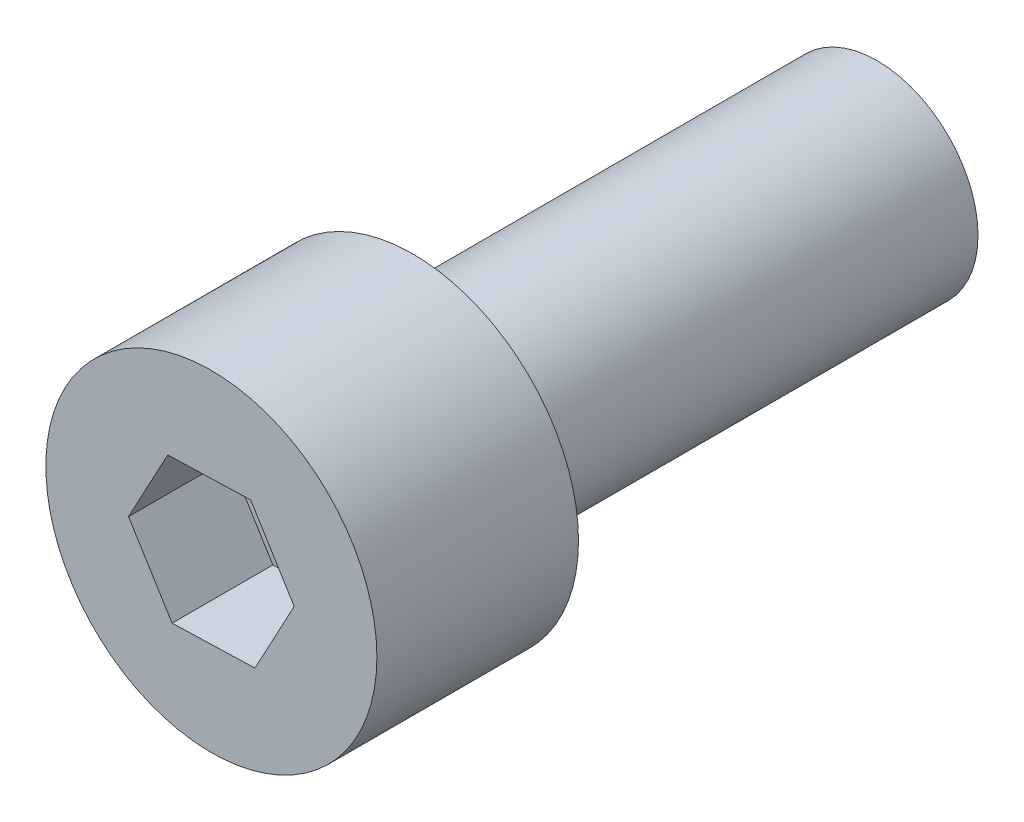
ISO-10303-21;
HEADER;
FILE_DESCRIPTION(('STEP AP214'),'2;1');
FILE_NAME('part.step','',(''),(''),'','','');
FILE_SCHEMA(('AUTOMOTIVE_DESIGN { 1 0 10303 214 1 1 1 1 }'));
ENDSEC;
DATA;
#1=APPLICATION_CONTEXT('core data for automotive mechanical design processes');
#2=APPLICATION_PROTOCOL_DEFINITION('international standard','automotive_design',2000,#1);
#3=PRODUCT_CONTEXT('',#1,'mechanical');
#4=PRODUCT('Part','Part','',(#3));
#5=PRODUCT_RELATED_PRODUCT_CATEGORY('part','',(#4));
#6=PRODUCT_DEFINITION_FORMATION('','',#4);
#7=PRODUCT_DEFINITION_CONTEXT('part definition',#1,'design');
#8=PRODUCT_DEFINITION('design','',#6,#7);
#9=PRODUCT_DEFINITION_SHAPE('','',#8);
#10=(LENGTH_UNIT() NAMED_UNIT(*) SI_UNIT(.MILLI.,.METRE.));
#11=(NAMED_UNIT(*) PLANE_ANGLE_UNIT() SI_UNIT($,.RADIAN.));
#12=(NAMED_UNIT(*) SI_UNIT($,.STERADIAN.) SOLID_ANGLE_UNIT());
#13=UNCERTAINTY_MEASURE_WITH_UNIT(LENGTH_MEASURE(1.E-05),#10,'distance_accuracy_value','');
#14=(GEOMETRIC_REPRESENTATION_CONTEXT(3) GLOBAL_UNCERTAINTY_ASSIGNED_CONTEXT((#13)) GLOBAL_UNIT_ASSIGNED_CONTEXT((#10,
#11,#12)) REPRESENTATION_CONTEXT('',''));
#15=CARTESIAN_POINT('',(0.,0.,0.));
#16=DIRECTION('',(0.,0.,1.));
#17=DIRECTION('',(1.,0.,0.));
#18=AXIS2_PLACEMENT_3D('',#15,#16,#17);
#19=CARTESIAN_POINT('',(0.,0.,11.1125));
#20=DIRECTION('',(0.,0.,-1.));
#21=DIRECTION('',(-1.,0.,0.));
#22=AXIS2_PLACEMENT_3D('',#19,#20,#21);
#23=CYLINDRICAL_SURFACE('',#22,2.413);
#24=CARTESIAN_POINT('',(0.,0.,11.1125));
#25=DIRECTION('',(0.,0.,1.));
#26=DIRECTION('',(1.,0.,0.));
#27=AXIS2_PLACEMENT_3D('',#24,#25,#26);
#28=CIRCLE('',#27,2.413);
#29=CARTESIAN_POINT('',(2.413,0.,11.1125));
#30=VERTEX_POINT('',#29);
#31=EDGE_CURVE('E11',#30,#30,#28,.T.);
#32=ORIENTED_EDGE('',*,*,#31,.F.);
#33=EDGE_LOOP('',(#32));
#34=FACE_BOUND('',#33,.T.);
#35=CARTESIAN_POINT('',(0.,0.,0.));
#36=DIRECTION('',(0.,0.,1.));
#37=DIRECTION('',(1.,0.,0.));
#38=AXIS2_PLACEMENT_3D('',#35,#36,#37);
#39=CIRCLE('',#38,2.413);
#40=CARTESIAN_POINT('',(2.413,0.,0.));
#41=VERTEX_POINT('',#40);
#42=EDGE_CURVE('E38',#41,#41,#39,.T.);
#43=ORIENTED_EDGE('',*,*,#42,.T.);
#44=EDGE_LOOP('',(#43));
#45=FACE_BOUND('',#44,.T.);
#46=ADVANCED_FACE('F35',(#34,#45),#23,.T.);
#47=CARTESIAN_POINT('',(0.,0.,0.));
#48=DIRECTION('',(0.,0.,1.));
#49=DIRECTION('',(1.,0.,0.));
#50=AXIS2_PLACEMENT_3D('',#47,#48,#49);
#51=PLANE('',#50);
#52=ORIENTED_EDGE('',*,*,#42,.F.);
#53=EDGE_LOOP('',(#52));
#54=FACE_BOUND('',#53,.T.);
#55=ADVANCED_FACE('F166',(#54),#51,.F.);
#56=CARTESIAN_POINT('',(0.,0.,15.9385));
#57=DIRECTION('',(0.,0.,-1.));
#58=DIRECTION('',(-1.,0.,0.));
#59=AXIS2_PLACEMENT_3D('',#56,#57,#58);
#60=CYLINDRICAL_SURFACE('',#59,3.9624);
#61=CARTESIAN_POINT('',(0.,0.,15.9385));
#62=DIRECTION('',(0.,0.,1.));
#63=DIRECTION('',(1.,0.,0.));
#64=AXIS2_PLACEMENT_3D('',#61,#62,#63);
#65=CIRCLE('',#64,3.9624);
#66=CARTESIAN_POINT('',(3.9624,0.,15.9385));
#67=VERTEX_POINT('',#66);
#68=EDGE_CURVE('E142',#67,#67,#65,.T.);
#69=ORIENTED_EDGE('',*,*,#68,.F.);
#70=EDGE_LOOP('',(#69));
#71=FACE_BOUND('',#70,.T.);
#72=CARTESIAN_POINT('',(0.,0.,11.1125));
#73=DIRECTION('',(0.,0.,1.));
#74=DIRECTION('',(1.,0.,0.));
#75=AXIS2_PLACEMENT_3D('',#72,#73,#74);
#76=CIRCLE('',#75,3.9624);
#77=CARTESIAN_POINT('',(3.9624,0.,11.1125));
#78=VERTEX_POINT('',#77);
#79=EDGE_CURVE('E136',#78,#78,#76,.T.);
#80=ORIENTED_EDGE('',*,*,#79,.T.);
#81=EDGE_LOOP('',(#80));
#82=FACE_BOUND('',#81,.T.);
#83=ADVANCED_FACE('F148',(#71,#82),#60,.T.);
#84=CARTESIAN_POINT('',(0.,0.,15.9385));
#85=DIRECTION('',(0.,0.,1.));
#86=DIRECTION('',(1.,0.,0.));
#87=AXIS2_PLACEMENT_3D('',#84,#85,#86);
#88=PLANE('',#87);
#89=DIRECTION('',(-0.999547217448398,-0.030089202235447,0.));
#90=VECTOR('',#89,1.);
#91=CARTESIAN_POINT('',(-0.0517088705698295,1.71774104514422,15.9385));
#92=LINE('',#91,#90);
#93=CARTESIAN_POINT('',(0.940029384242255,1.7475951754872,15.9385));
#94=VERTEX_POINT('',#93);
#95=CARTESIAN_POINT('',(-1.04344712538191,1.68788691480123,15.9385));
#96=VERTEX_POINT('',#95);
#97=EDGE_CURVE('E49',#94,#96,#92,.T.);
#98=ORIENTED_EDGE('',*,*,#97,.F.);
#99=DIRECTION('',(-0.525831622239703,0.850588681474638,0.));
#100=VECTOR('',#99,1.);
#101=CARTESIAN_POINT('',(1.46175294693321,0.903651718086582,15.9385));
#102=LINE('',#101,#100);
#103=CARTESIAN_POINT('',(1.98347650962416,0.0597082606859642,15.9385));
#104=VERTEX_POINT('',#103);
#105=EDGE_CURVE('E132',#104,#94,#102,.T.);
#106=ORIENTED_EDGE('',*,*,#105,.F.);
#107=DIRECTION('',(0.473715595208694,0.880677883710084,0.));
#108=VECTOR('',#107,1.);
#109=CARTESIAN_POINT('',(1.51346181750304,-0.814089327057635,15.9385));
#110=LINE('',#109,#108);
#111=CARTESIAN_POINT('',(1.04344712538191,-1.68788691480123,15.9385));
#112=VERTEX_POINT('',#111);
#113=EDGE_CURVE('E130',#112,#104,#110,.T.);
#114=ORIENTED_EDGE('',*,*,#113,.F.);
#115=DIRECTION('',(0.999547217448398,0.0300892022354463,0.));
#116=VECTOR('',#115,1.);
#117=CARTESIAN_POINT('',(0.0517088705698284,-1.71774104514422,15.9385));
#118=LINE('',#117,#116);
#119=CARTESIAN_POINT('',(-0.940029384242252,-1.7475951754872,15.9385));
#120=VERTEX_POINT('',#119);
#121=EDGE_CURVE('E97',#120,#112,#118,.T.);
#122=ORIENTED_EDGE('',*,*,#121,.F.);
#123=DIRECTION('',(0.525831622239703,-0.850588681474638,0.));
#124=VECTOR('',#123,1.);
#125=CARTESIAN_POINT('',(-1.46175294693321,-0.90365171808658,15.9385));
#126=LINE('',#125,#124);
#127=CARTESIAN_POINT('',(-1.98347650962416,-0.0597082606859649,15.9385));
#128=VERTEX_POINT('',#127);
#129=EDGE_CURVE('E126',#128,#120,#126,.T.);
#130=ORIENTED_EDGE('',*,*,#129,.F.);
#131=DIRECTION('',(-0.473715595208694,-0.880677883710084,0.));
#132=VECTOR('',#131,1.);
#133=CARTESIAN_POINT('',(-1.51346181750304,0.814089327057633,15.9385));
#134=LINE('',#133,#132);
#135=EDGE_CURVE('E123',#96,#128,#134,.T.);
#136=ORIENTED_EDGE('',*,*,#135,.F.);
#137=EDGE_LOOP('',(#98,#106,#114,#122,#130,#136));
#138=FACE_BOUND('',#137,.T.);
#139=ORIENTED_EDGE('',*,*,#68,.T.);
#140=EDGE_LOOP('',(#139));
#141=FACE_BOUND('',#140,.T.);
#142=ADVANCED_FACE('F153',(#138,#141),#88,.T.);
#143=CARTESIAN_POINT('',(0.,0.,11.1125));
#144=DIRECTION('',(0.,0.,1.));
#145=DIRECTION('',(1.,0.,0.));
#146=AXIS2_PLACEMENT_3D('',#143,#144,#145);
#147=PLANE('',#146);
#148=ORIENTED_EDGE('',*,*,#31,.T.);
#149=EDGE_LOOP('',(#148));
#150=FACE_BOUND('',#149,.T.);
#151=ORIENTED_EDGE('',*,*,#79,.F.);
#152=EDGE_LOOP('',(#151));
#153=FACE_BOUND('',#152,.T.);
#154=ADVANCED_FACE('F150',(#150,#153),#147,.F.);
#155=CARTESIAN_POINT('',(-0.0517088705698295,1.71774104514422,13.5255));
#156=DIRECTION('',(-0.030089202235447,0.999547217448398,0.));
#157=DIRECTION('',(-0.999547217448398,-0.030089202235447,0.));
#158=AXIS2_PLACEMENT_3D('',#155,#156,#157);
#159=PLANE('',#158);
#160=ORIENTED_EDGE('',*,*,#97,.T.);
#161=DIRECTION('',(0.,0.,1.));
#162=VECTOR('',#161,1.);
#163=CARTESIAN_POINT('',(-1.04344712538191,1.68788691480123,13.5255));
#164=LINE('',#163,#162);
#165=CARTESIAN_POINT('',(-1.04344712538191,1.68788691480123,13.5255));
#166=VERTEX_POINT('',#165);
#167=EDGE_CURVE('E79',#166,#96,#164,.T.);
#168=ORIENTED_EDGE('',*,*,#167,.F.);
#169=DIRECTION('',(-0.999547217448398,-0.030089202235447,0.));
#170=VECTOR('',#169,1.);
#171=CARTESIAN_POINT('',(-0.0517088705698295,1.71774104514422,13.5255));
#172=LINE('',#171,#170);
#173=CARTESIAN_POINT('',(0.940029384242255,1.7475951754872,13.5255));
#174=VERTEX_POINT('',#173);
#175=EDGE_CURVE('E134',#174,#166,#172,.T.);
#176=ORIENTED_EDGE('',*,*,#175,.F.);
#177=DIRECTION('',(0.,0.,1.));
#178=VECTOR('',#177,1.);
#179=CARTESIAN_POINT('',(0.940029384242255,1.7475951754872,13.5255));
#180=LINE('',#179,#178);
#181=EDGE_CURVE('E57',#174,#94,#180,.T.);
#182=ORIENTED_EDGE('',*,*,#181,.T.);
#183=EDGE_LOOP('',(#160,#168,#176,#182));
#184=FACE_BOUND('',#183,.T.);
#185=ADVANCED_FACE('F152',(#184),#159,.F.);
#186=CARTESIAN_POINT('',(1.46175294693321,0.903651718086582,13.5255));
#187=DIRECTION('',(0.850588681474637,0.525831622239703,0.));
#188=DIRECTION('',(-0.525831622239703,0.850588681474638,0.));
#189=AXIS2_PLACEMENT_3D('',#186,#187,#188);
#190=PLANE('',#189);
#191=ORIENTED_EDGE('',*,*,#105,.T.);
#192=ORIENTED_EDGE('',*,*,#181,.F.);
#193=DIRECTION('',(-0.525831622239703,0.850588681474638,0.));
#194=VECTOR('',#193,1.);
#195=CARTESIAN_POINT('',(1.46175294693321,0.903651718086582,13.5255));
#196=LINE('',#195,#194);
#197=CARTESIAN_POINT('',(1.98347650962416,0.0597082606859642,13.5255));
#198=VERTEX_POINT('',#197);
#199=EDGE_CURVE('E109',#198,#174,#196,.T.);
#200=ORIENTED_EDGE('',*,*,#199,.F.);
#201=DIRECTION('',(0.,0.,1.));
#202=VECTOR('',#201,1.);
#203=CARTESIAN_POINT('',(1.98347650962416,0.0597082606859642,13.5255));
#204=LINE('',#203,#202);
#205=EDGE_CURVE('E101',#198,#104,#204,.T.);
#206=ORIENTED_EDGE('',*,*,#205,.T.);
#207=EDGE_LOOP('',(#191,#192,#200,#206));
#208=FACE_BOUND('',#207,.T.);
#209=ADVANCED_FACE('F160',(#208),#190,.F.);
#210=CARTESIAN_POINT('',(1.51346181750304,-0.814089327057635,13.5255));
#211=DIRECTION('',(0.880677883710084,-0.473715595208694,0.));
#212=DIRECTION('',(0.473715595208694,0.880677883710084,0.));
#213=AXIS2_PLACEMENT_3D('',#210,#211,#212);
#214=PLANE('',#213);
#215=ORIENTED_EDGE('',*,*,#113,.T.);
#216=ORIENTED_EDGE('',*,*,#205,.F.);
#217=DIRECTION('',(0.473715595208694,0.880677883710084,0.));
#218=VECTOR('',#217,1.);
#219=CARTESIAN_POINT('',(1.51346181750304,-0.814089327057635,13.5255));
#220=LINE('',#219,#218);
#221=CARTESIAN_POINT('',(1.04344712538191,-1.68788691480123,13.5255));
#222=VERTEX_POINT('',#221);
#223=EDGE_CURVE('E105',#222,#198,#220,.T.);
#224=ORIENTED_EDGE('',*,*,#223,.F.);
#225=DIRECTION('',(0.,0.,1.));
#226=VECTOR('',#225,1.);
#227=CARTESIAN_POINT('',(1.04344712538191,-1.68788691480123,13.5255));
#228=LINE('',#227,#226);
#229=EDGE_CURVE('E90',#222,#112,#228,.T.);
#230=ORIENTED_EDGE('',*,*,#229,.T.);
#231=EDGE_LOOP('',(#215,#216,#224,#230));
#232=FACE_BOUND('',#231,.T.);
#233=ADVANCED_FACE('F106',(#232),#214,.F.);
#234=CARTESIAN_POINT('',(0.0517088705698284,-1.71774104514422,13.5255));
#235=DIRECTION('',(0.0300892022354463,-0.999547217448398,0.));
#236=DIRECTION('',(0.999547217448398,0.0300892022354463,0.));
#237=AXIS2_PLACEMENT_3D('',#234,#235,#236);
#238=PLANE('',#237);
#239=ORIENTED_EDGE('',*,*,#121,.T.);
#240=ORIENTED_EDGE('',*,*,#229,.F.);
#241=DIRECTION('',(0.999547217448398,0.0300892022354463,0.));
#242=VECTOR('',#241,1.);
#243=CARTESIAN_POINT('',(0.0517088705698284,-1.71774104514422,13.5255));
#244=LINE('',#243,#242);
#245=CARTESIAN_POINT('',(-0.940029384242252,-1.7475951754872,13.5255));
#246=VERTEX_POINT('',#245);
#247=EDGE_CURVE('E94',#246,#222,#244,.T.);
#248=ORIENTED_EDGE('',*,*,#247,.F.);
#249=DIRECTION('',(0.,0.,1.));
#250=VECTOR('',#249,1.);
#251=CARTESIAN_POINT('',(-0.940029384242252,-1.7475951754872,13.5255));
#252=LINE('',#251,#250);
#253=EDGE_CURVE('E102',#246,#120,#252,.T.);
#254=ORIENTED_EDGE('',*,*,#253,.T.);
#255=EDGE_LOOP('',(#239,#240,#248,#254));
#256=FACE_BOUND('',#255,.T.);
#257=ADVANCED_FACE('F92',(#256),#238,.F.);
#258=CARTESIAN_POINT('',(-1.46175294693321,-0.90365171808658,13.5255));
#259=DIRECTION('',(-0.850588681474638,-0.525831622239703,0.));
#260=DIRECTION('',(0.525831622239703,-0.850588681474638,0.));
#261=AXIS2_PLACEMENT_3D('',#258,#259,#260);
#262=PLANE('',#261);
#263=ORIENTED_EDGE('',*,*,#129,.T.);
#264=ORIENTED_EDGE('',*,*,#253,.F.);
#265=DIRECTION('',(0.525831622239703,-0.850588681474638,0.));
#266=VECTOR('',#265,1.);
#267=CARTESIAN_POINT('',(-1.46175294693321,-0.90365171808658,13.5255));
#268=LINE('',#267,#266);
#269=CARTESIAN_POINT('',(-1.98347650962416,-0.0597082606859649,13.5255));
#270=VERTEX_POINT('',#269);
#271=EDGE_CURVE('E115',#270,#246,#268,.T.);
#272=ORIENTED_EDGE('',*,*,#271,.F.);
#273=DIRECTION('',(0.,0.,1.));
#274=VECTOR('',#273,1.);
#275=CARTESIAN_POINT('',(-1.98347650962416,-0.0597082606859649,13.5255));
#276=LINE('',#275,#274);
#277=EDGE_CURVE('E139',#270,#128,#276,.T.);
#278=ORIENTED_EDGE('',*,*,#277,.T.);
#279=EDGE_LOOP('',(#263,#264,#272,#278));
#280=FACE_BOUND('',#279,.T.);
#281=ADVANCED_FACE('F221',(#280),#262,.F.);
#282=CARTESIAN_POINT('',(-1.51346181750304,0.814089327057633,13.5255));
#283=DIRECTION('',(-0.880677883710084,0.473715595208694,0.));
#284=DIRECTION('',(-0.473715595208694,-0.880677883710084,0.));
#285=AXIS2_PLACEMENT_3D('',#282,#283,#284);
#286=PLANE('',#285);
#287=ORIENTED_EDGE('',*,*,#135,.T.);
#288=ORIENTED_EDGE('',*,*,#277,.F.);
#289=DIRECTION('',(-0.473715595208694,-0.880677883710084,0.));
#290=VECTOR('',#289,1.);
#291=CARTESIAN_POINT('',(-1.51346181750304,0.814089327057633,13.5255));
#292=LINE('',#291,#290);
#293=EDGE_CURVE('E117',#166,#270,#292,.T.);
#294=ORIENTED_EDGE('',*,*,#293,.F.);
#295=ORIENTED_EDGE('',*,*,#167,.T.);
#296=EDGE_LOOP('',(#287,#288,#294,#295));
#297=FACE_BOUND('',#296,.T.);
#298=ADVANCED_FACE('F230',(#297),#286,.F.);
#299=CARTESIAN_POINT('',(0.,0.,13.5255));
#300=DIRECTION('',(0.,0.,1.));
#301=DIRECTION('',(1.,0.,0.));
#302=AXIS2_PLACEMENT_3D('',#299,#300,#301);
#303=PLANE('',#302);
#304=ORIENTED_EDGE('',*,*,#175,.T.);
#305=ORIENTED_EDGE('',*,*,#293,.T.);
#306=ORIENTED_EDGE('',*,*,#271,.T.);
#307=ORIENTED_EDGE('',*,*,#247,.T.);
#308=ORIENTED_EDGE('',*,*,#223,.T.);
#309=ORIENTED_EDGE('',*,*,#199,.T.);
#310=EDGE_LOOP('',(#304,#305,#306,#307,#308,#309));
#311=FACE_BOUND('',#310,.T.);
#312=ADVANCED_FACE('F112',(#311),#303,.T.);
#313=CLOSED_SHELL('',(#46,#55,#83,#142,#154,#185,#209,#233,#257,#281,#298,#312));
#314=MANIFOLD_SOLID_BREP('B2',#313);
#315=ADVANCED_BREP_SHAPE_REPRESENTATION('',(#18,#314),#14);
#316=SHAPE_DEFINITION_REPRESENTATION(#9,#315);
ENDSEC;
END-ISO-10303-21;
